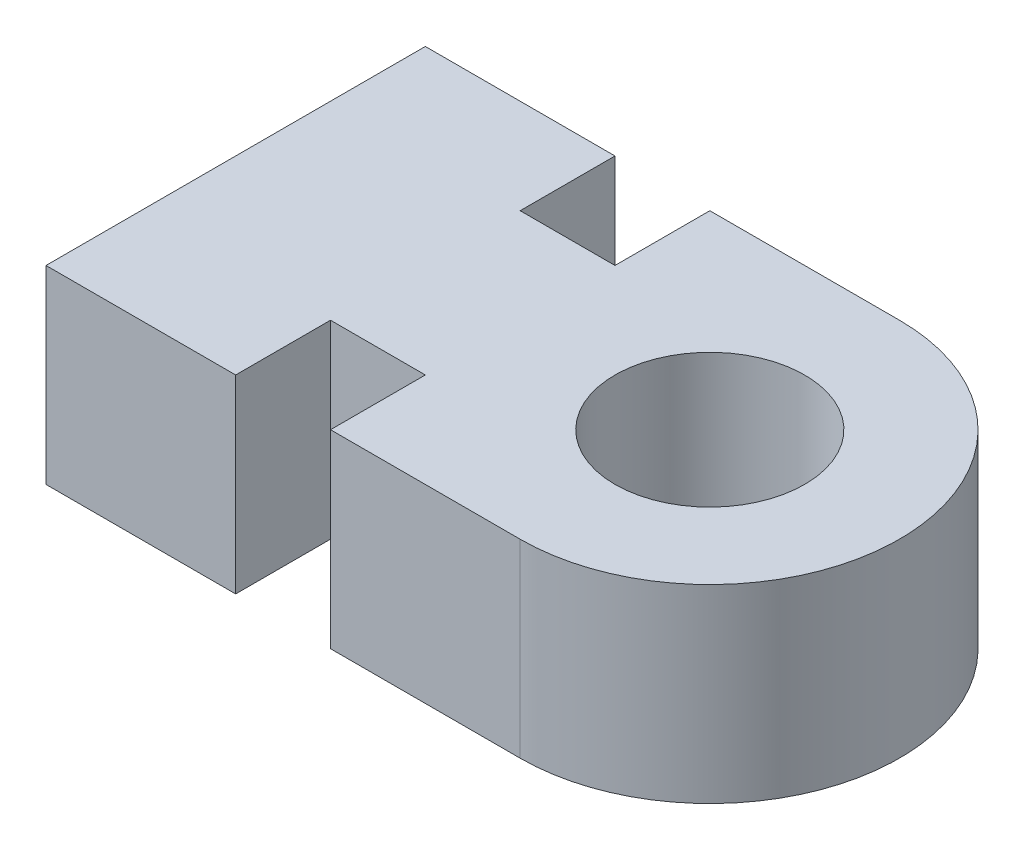
ISO-10303-21;
HEADER;
FILE_DESCRIPTION(('STEP AP214'),'2;1');
FILE_NAME('part.step','',(''),(''),'','','');
FILE_SCHEMA(('AUTOMOTIVE_DESIGN { 1 0 10303 214 1 1 1 1 }'));
ENDSEC;
DATA;
#1=APPLICATION_CONTEXT('core data for automotive mechanical design processes');
#2=APPLICATION_PROTOCOL_DEFINITION('international standard','automotive_design',2000,#1);
#3=PRODUCT_CONTEXT('',#1,'mechanical');
#4=PRODUCT('Part','Part','',(#3));
#5=PRODUCT_RELATED_PRODUCT_CATEGORY('part','',(#4));
#6=PRODUCT_DEFINITION_FORMATION('','',#4);
#7=PRODUCT_DEFINITION_CONTEXT('part definition',#1,'design');
#8=PRODUCT_DEFINITION('design','',#6,#7);
#9=PRODUCT_DEFINITION_SHAPE('','',#8);
#10=(LENGTH_UNIT() NAMED_UNIT(*) SI_UNIT(.MILLI.,.METRE.));
#11=(NAMED_UNIT(*) PLANE_ANGLE_UNIT() SI_UNIT($,.RADIAN.));
#12=(NAMED_UNIT(*) SI_UNIT($,.STERADIAN.) SOLID_ANGLE_UNIT());
#13=UNCERTAINTY_MEASURE_WITH_UNIT(LENGTH_MEASURE(1.E-05),#10,'distance_accuracy_value','');
#14=(GEOMETRIC_REPRESENTATION_CONTEXT(3) GLOBAL_UNCERTAINTY_ASSIGNED_CONTEXT((#13)) GLOBAL_UNIT_ASSIGNED_CONTEXT((#10,
#11,#12)) REPRESENTATION_CONTEXT('',''));
#15=CARTESIAN_POINT('',(0.,0.,0.));
#16=DIRECTION('',(0.,0.,1.));
#17=DIRECTION('',(1.,0.,0.));
#18=AXIS2_PLACEMENT_3D('',#15,#16,#17);
#19=CARTESIAN_POINT('',(0.,10.,0.));
#20=DIRECTION('',(0.,1.,0.));
#21=DIRECTION('',(0.,0.,1.));
#22=AXIS2_PLACEMENT_3D('',#19,#20,#21);
#23=PLANE('',#22);
#24=DIRECTION('',(1.,0.,0.));
#25=VECTOR('',#24,1.);
#26=CARTESIAN_POINT('',(-15.,10.,10.));
#27=LINE('',#26,#25);
#28=CARTESIAN_POINT('',(-25.,10.,10.));
#29=VERTEX_POINT('',#28);
#30=CARTESIAN_POINT('',(-15.,10.,10.));
#31=VERTEX_POINT('',#30);
#32=EDGE_CURVE('E177',#29,#31,#27,.T.);
#33=ORIENTED_EDGE('',*,*,#32,.T.);
#34=DIRECTION('',(0.,0.,-1.));
#35=VECTOR('',#34,1.);
#36=CARTESIAN_POINT('',(-15.,10.,5.));
#37=LINE('',#36,#35);
#38=CARTESIAN_POINT('',(-15.,10.,5.));
#39=VERTEX_POINT('',#38);
#40=EDGE_CURVE('E105',#31,#39,#37,.T.);
#41=ORIENTED_EDGE('',*,*,#40,.T.);
#42=DIRECTION('',(1.,0.,0.));
#43=VECTOR('',#42,1.);
#44=CARTESIAN_POINT('',(-10.,10.,5.));
#45=LINE('',#44,#43);
#46=CARTESIAN_POINT('',(-10.,10.,5.));
#47=VERTEX_POINT('',#46);
#48=EDGE_CURVE('E204',#39,#47,#45,.T.);
#49=ORIENTED_EDGE('',*,*,#48,.T.);
#50=DIRECTION('',(0.,0.,1.));
#51=VECTOR('',#50,1.);
#52=CARTESIAN_POINT('',(-10.,10.,10.));
#53=LINE('',#52,#51);
#54=CARTESIAN_POINT('',(-10.,10.,10.));
#55=VERTEX_POINT('',#54);
#56=EDGE_CURVE('E223',#47,#55,#53,.T.);
#57=ORIENTED_EDGE('',*,*,#56,.T.);
#58=DIRECTION('',(1.,0.,0.));
#59=VECTOR('',#58,1.);
#60=CARTESIAN_POINT('',(0.,10.,10.));
#61=LINE('',#60,#59);
#62=CARTESIAN_POINT('',(0.,10.,10.));
#63=VERTEX_POINT('',#62);
#64=EDGE_CURVE('E220',#55,#63,#61,.T.);
#65=ORIENTED_EDGE('',*,*,#64,.T.);
#66=CARTESIAN_POINT('',(0.,10.,0.));
#67=DIRECTION('',(0.,1.,0.));
#68=DIRECTION('',(0.,0.,1.));
#69=AXIS2_PLACEMENT_3D('',#66,#67,#68);
#70=CIRCLE('',#69,10.);
#71=CARTESIAN_POINT('',(0.,10.,-10.));
#72=VERTEX_POINT('',#71);
#73=EDGE_CURVE('E222',#63,#72,#70,.T.);
#74=ORIENTED_EDGE('',*,*,#73,.T.);
#75=DIRECTION('',(-1.,0.,0.));
#76=VECTOR('',#75,1.);
#77=CARTESIAN_POINT('',(0.,10.,-10.));
#78=LINE('',#77,#76);
#79=CARTESIAN_POINT('',(-10.,10.,-10.));
#80=VERTEX_POINT('',#79);
#81=EDGE_CURVE('E225',#72,#80,#78,.T.);
#82=ORIENTED_EDGE('',*,*,#81,.T.);
#83=DIRECTION('',(0.,0.,1.));
#84=VECTOR('',#83,1.);
#85=CARTESIAN_POINT('',(-10.,10.,-10.));
#86=LINE('',#85,#84);
#87=CARTESIAN_POINT('',(-10.,10.,-5.));
#88=VERTEX_POINT('',#87);
#89=EDGE_CURVE('E231',#80,#88,#86,.T.);
#90=ORIENTED_EDGE('',*,*,#89,.T.);
#91=DIRECTION('',(-1.,0.,0.));
#92=VECTOR('',#91,1.);
#93=CARTESIAN_POINT('',(-10.,10.,-5.));
#94=LINE('',#93,#92);
#95=CARTESIAN_POINT('',(-15.,10.,-5.));
#96=VERTEX_POINT('',#95);
#97=EDGE_CURVE('E136',#88,#96,#94,.T.);
#98=ORIENTED_EDGE('',*,*,#97,.T.);
#99=DIRECTION('',(0.,0.,-1.));
#100=VECTOR('',#99,1.);
#101=CARTESIAN_POINT('',(-15.,10.,-5.));
#102=LINE('',#101,#100);
#103=CARTESIAN_POINT('',(-15.,10.,-10.));
#104=VERTEX_POINT('',#103);
#105=EDGE_CURVE('E130',#96,#104,#102,.T.);
#106=ORIENTED_EDGE('',*,*,#105,.T.);
#107=DIRECTION('',(-1.,0.,0.));
#108=VECTOR('',#107,1.);
#109=CARTESIAN_POINT('',(-15.,10.,-10.));
#110=LINE('',#109,#108);
#111=CARTESIAN_POINT('',(-25.,10.,-10.));
#112=VERTEX_POINT('',#111);
#113=EDGE_CURVE('E134',#104,#112,#110,.T.);
#114=ORIENTED_EDGE('',*,*,#113,.T.);
#115=DIRECTION('',(0.,0.,1.));
#116=VECTOR('',#115,1.);
#117=CARTESIAN_POINT('',(-25.,10.,-10.));
#118=LINE('',#117,#116);
#119=EDGE_CURVE('E50',#112,#29,#118,.T.);
#120=ORIENTED_EDGE('',*,*,#119,.T.);
#121=EDGE_LOOP('',(#33,#41,#49,#57,#65,#74,#82,#90,#98,#106,#114,#120));
#122=FACE_BOUND('',#121,.T.);
#123=CARTESIAN_POINT('',(0.,10.,0.));
#124=DIRECTION('',(0.,1.,0.));
#125=DIRECTION('',(0.,0.,1.));
#126=AXIS2_PLACEMENT_3D('',#123,#124,#125);
#127=CIRCLE('',#126,5.);
#128=CARTESIAN_POINT('',(0.,10.,5.));
#129=VERTEX_POINT('',#128);
#130=EDGE_CURVE('E158',#129,#129,#127,.T.);
#131=ORIENTED_EDGE('',*,*,#130,.F.);
#132=EDGE_LOOP('',(#131));
#133=FACE_BOUND('',#132,.T.);
#134=ADVANCED_FACE('F33',(#122,#133),#23,.T.);
#135=CARTESIAN_POINT('',(0.,0.,0.));
#136=DIRECTION('',(0.,1.,0.));
#137=DIRECTION('',(0.,0.,1.));
#138=AXIS2_PLACEMENT_3D('',#135,#136,#137);
#139=PLANE('',#138);
#140=DIRECTION('',(1.,0.,0.));
#141=VECTOR('',#140,1.);
#142=CARTESIAN_POINT('',(-15.,0.,10.));
#143=LINE('',#142,#141);
#144=CARTESIAN_POINT('',(-25.,0.,10.));
#145=VERTEX_POINT('',#144);
#146=CARTESIAN_POINT('',(-15.,0.,10.));
#147=VERTEX_POINT('',#146);
#148=EDGE_CURVE('E154',#145,#147,#143,.T.);
#149=ORIENTED_EDGE('',*,*,#148,.F.);
#150=DIRECTION('',(0.,0.,1.));
#151=VECTOR('',#150,1.);
#152=CARTESIAN_POINT('',(-25.,0.,-10.));
#153=LINE('',#152,#151);
#154=CARTESIAN_POINT('',(-25.,0.,-10.));
#155=VERTEX_POINT('',#154);
#156=EDGE_CURVE('E97',#155,#145,#153,.T.);
#157=ORIENTED_EDGE('',*,*,#156,.F.);
#158=DIRECTION('',(-1.,0.,0.));
#159=VECTOR('',#158,1.);
#160=CARTESIAN_POINT('',(-15.,0.,-10.));
#161=LINE('',#160,#159);
#162=CARTESIAN_POINT('',(-15.,0.,-10.));
#163=VERTEX_POINT('',#162);
#164=EDGE_CURVE('E91',#163,#155,#161,.T.);
#165=ORIENTED_EDGE('',*,*,#164,.F.);
#166=DIRECTION('',(0.,0.,-1.));
#167=VECTOR('',#166,1.);
#168=CARTESIAN_POINT('',(-15.,0.,-5.));
#169=LINE('',#168,#167);
#170=CARTESIAN_POINT('',(-15.,0.,-5.));
#171=VERTEX_POINT('',#170);
#172=EDGE_CURVE('E144',#171,#163,#169,.T.);
#173=ORIENTED_EDGE('',*,*,#172,.F.);
#174=DIRECTION('',(-1.,0.,0.));
#175=VECTOR('',#174,1.);
#176=CARTESIAN_POINT('',(-10.,0.,-5.));
#177=LINE('',#176,#175);
#178=CARTESIAN_POINT('',(-10.,0.,-5.));
#179=VERTEX_POINT('',#178);
#180=EDGE_CURVE('E172',#179,#171,#177,.T.);
#181=ORIENTED_EDGE('',*,*,#180,.F.);
#182=DIRECTION('',(0.,0.,1.));
#183=VECTOR('',#182,1.);
#184=CARTESIAN_POINT('',(-10.,0.,-10.));
#185=LINE('',#184,#183);
#186=CARTESIAN_POINT('',(-10.,0.,-10.));
#187=VERTEX_POINT('',#186);
#188=EDGE_CURVE('E170',#187,#179,#185,.T.);
#189=ORIENTED_EDGE('',*,*,#188,.F.);
#190=DIRECTION('',(-1.,0.,0.));
#191=VECTOR('',#190,1.);
#192=CARTESIAN_POINT('',(0.,0.,-10.));
#193=LINE('',#192,#191);
#194=CARTESIAN_POINT('',(0.,0.,-10.));
#195=VERTEX_POINT('',#194);
#196=EDGE_CURVE('E168',#195,#187,#193,.T.);
#197=ORIENTED_EDGE('',*,*,#196,.F.);
#198=CARTESIAN_POINT('',(0.,0.,0.));
#199=DIRECTION('',(0.,1.,0.));
#200=DIRECTION('',(0.,0.,1.));
#201=AXIS2_PLACEMENT_3D('',#198,#199,#200);
#202=CIRCLE('',#201,10.);
#203=CARTESIAN_POINT('',(0.,0.,10.));
#204=VERTEX_POINT('',#203);
#205=EDGE_CURVE('E166',#204,#195,#202,.T.);
#206=ORIENTED_EDGE('',*,*,#205,.F.);
#207=DIRECTION('',(1.,0.,0.));
#208=VECTOR('',#207,1.);
#209=CARTESIAN_POINT('',(0.,0.,10.));
#210=LINE('',#209,#208);
#211=CARTESIAN_POINT('',(-10.,0.,10.));
#212=VERTEX_POINT('',#211);
#213=EDGE_CURVE('E164',#212,#204,#210,.T.);
#214=ORIENTED_EDGE('',*,*,#213,.F.);
#215=DIRECTION('',(0.,0.,1.));
#216=VECTOR('',#215,1.);
#217=CARTESIAN_POINT('',(-10.,0.,10.));
#218=LINE('',#217,#216);
#219=CARTESIAN_POINT('',(-10.,0.,5.));
#220=VERTEX_POINT('',#219);
#221=EDGE_CURVE('E162',#220,#212,#218,.T.);
#222=ORIENTED_EDGE('',*,*,#221,.F.);
#223=DIRECTION('',(1.,0.,0.));
#224=VECTOR('',#223,1.);
#225=CARTESIAN_POINT('',(-10.,0.,5.));
#226=LINE('',#225,#224);
#227=CARTESIAN_POINT('',(-15.,0.,5.));
#228=VERTEX_POINT('',#227);
#229=EDGE_CURVE('E160',#228,#220,#226,.T.);
#230=ORIENTED_EDGE('',*,*,#229,.F.);
#231=DIRECTION('',(0.,0.,-1.));
#232=VECTOR('',#231,1.);
#233=CARTESIAN_POINT('',(-15.,0.,5.));
#234=LINE('',#233,#232);
#235=EDGE_CURVE('E157',#147,#228,#234,.T.);
#236=ORIENTED_EDGE('',*,*,#235,.F.);
#237=EDGE_LOOP('',(#149,#157,#165,#173,#181,#189,#197,#206,#214,#222,#230,#236));
#238=FACE_BOUND('',#237,.T.);
#239=CARTESIAN_POINT('',(0.,0.,0.));
#240=DIRECTION('',(0.,1.,0.));
#241=DIRECTION('',(0.,0.,1.));
#242=AXIS2_PLACEMENT_3D('',#239,#240,#241);
#243=CIRCLE('',#242,5.);
#244=CARTESIAN_POINT('',(0.,0.,5.));
#245=VERTEX_POINT('',#244);
#246=EDGE_CURVE('E378',#245,#245,#243,.T.);
#247=ORIENTED_EDGE('',*,*,#246,.T.);
#248=EDGE_LOOP('',(#247));
#249=FACE_BOUND('',#248,.T.);
#250=ADVANCED_FACE('F208',(#238,#249),#139,.F.);
#251=CARTESIAN_POINT('',(-15.,10.,10.));
#252=DIRECTION('',(0.,0.,-1.));
#253=DIRECTION('',(-1.,0.,0.));
#254=AXIS2_PLACEMENT_3D('',#251,#252,#253);
#255=PLANE('',#254);
#256=ORIENTED_EDGE('',*,*,#148,.T.);
#257=DIRECTION('',(0.,-1.,0.));
#258=VECTOR('',#257,1.);
#259=CARTESIAN_POINT('',(-15.,10.,10.));
#260=LINE('',#259,#258);
#261=EDGE_CURVE('E11',#31,#147,#260,.T.);
#262=ORIENTED_EDGE('',*,*,#261,.F.);
#263=ORIENTED_EDGE('',*,*,#32,.F.);
#264=DIRECTION('',(0.,-1.,0.));
#265=VECTOR('',#264,1.);
#266=CARTESIAN_POINT('',(-25.,10.,10.));
#267=LINE('',#266,#265);
#268=EDGE_CURVE('E150',#29,#145,#267,.T.);
#269=ORIENTED_EDGE('',*,*,#268,.T.);
#270=EDGE_LOOP('',(#256,#262,#263,#269));
#271=FACE_BOUND('',#270,.T.);
#272=ADVANCED_FACE('F35',(#271),#255,.F.);
#273=CARTESIAN_POINT('',(-15.,10.,5.));
#274=DIRECTION('',(-1.,0.,0.));
#275=DIRECTION('',(0.,0.,1.));
#276=AXIS2_PLACEMENT_3D('',#273,#274,#275);
#277=PLANE('',#276);
#278=ORIENTED_EDGE('',*,*,#235,.T.);
#279=DIRECTION('',(0.,-1.,0.));
#280=VECTOR('',#279,1.);
#281=CARTESIAN_POINT('',(-15.,10.,5.));
#282=LINE('',#281,#280);
#283=EDGE_CURVE('E42',#39,#228,#282,.T.);
#284=ORIENTED_EDGE('',*,*,#283,.F.);
#285=ORIENTED_EDGE('',*,*,#40,.F.);
#286=ORIENTED_EDGE('',*,*,#261,.T.);
#287=EDGE_LOOP('',(#278,#284,#285,#286));
#288=FACE_BOUND('',#287,.T.);
#289=ADVANCED_FACE('F265',(#288),#277,.F.);
#290=CARTESIAN_POINT('',(-10.,10.,5.));
#291=DIRECTION('',(0.,0.,-1.));
#292=DIRECTION('',(-1.,0.,0.));
#293=AXIS2_PLACEMENT_3D('',#290,#291,#292);
#294=PLANE('',#293);
#295=ORIENTED_EDGE('',*,*,#229,.T.);
#296=DIRECTION('',(0.,-1.,0.));
#297=VECTOR('',#296,1.);
#298=CARTESIAN_POINT('',(-10.,10.,5.));
#299=LINE('',#298,#297);
#300=EDGE_CURVE('E196',#47,#220,#299,.T.);
#301=ORIENTED_EDGE('',*,*,#300,.F.);
#302=ORIENTED_EDGE('',*,*,#48,.F.);
#303=ORIENTED_EDGE('',*,*,#283,.T.);
#304=EDGE_LOOP('',(#295,#301,#302,#303));
#305=FACE_BOUND('',#304,.T.);
#306=ADVANCED_FACE('F202',(#305),#294,.F.);
#307=CARTESIAN_POINT('',(-10.,10.,10.));
#308=DIRECTION('',(1.,0.,0.));
#309=DIRECTION('',(0.,0.,-1.));
#310=AXIS2_PLACEMENT_3D('',#307,#308,#309);
#311=PLANE('',#310);
#312=ORIENTED_EDGE('',*,*,#221,.T.);
#313=DIRECTION('',(0.,-1.,0.));
#314=VECTOR('',#313,1.);
#315=CARTESIAN_POINT('',(-10.,10.,10.));
#316=LINE('',#315,#314);
#317=EDGE_CURVE('E193',#55,#212,#316,.T.);
#318=ORIENTED_EDGE('',*,*,#317,.F.);
#319=ORIENTED_EDGE('',*,*,#56,.F.);
#320=ORIENTED_EDGE('',*,*,#300,.T.);
#321=EDGE_LOOP('',(#312,#318,#319,#320));
#322=FACE_BOUND('',#321,.T.);
#323=ADVANCED_FACE('F214',(#322),#311,.F.);
#324=CARTESIAN_POINT('',(0.,10.,10.));
#325=DIRECTION('',(0.,0.,-1.));
#326=DIRECTION('',(-1.,0.,0.));
#327=AXIS2_PLACEMENT_3D('',#324,#325,#326);
#328=PLANE('',#327);
#329=ORIENTED_EDGE('',*,*,#213,.T.);
#330=DIRECTION('',(0.,-1.,0.));
#331=VECTOR('',#330,1.);
#332=CARTESIAN_POINT('',(0.,10.,10.));
#333=LINE('',#332,#331);
#334=EDGE_CURVE('E190',#63,#204,#333,.T.);
#335=ORIENTED_EDGE('',*,*,#334,.F.);
#336=ORIENTED_EDGE('',*,*,#64,.F.);
#337=ORIENTED_EDGE('',*,*,#317,.T.);
#338=EDGE_LOOP('',(#329,#335,#336,#337));
#339=FACE_BOUND('',#338,.T.);
#340=ADVANCED_FACE('F218',(#339),#328,.F.);
#341=CARTESIAN_POINT('',(0.,10.,0.));
#342=DIRECTION('',(0.,-1.,0.));
#343=DIRECTION('',(0.,0.,-1.));
#344=AXIS2_PLACEMENT_3D('',#341,#342,#343);
#345=CYLINDRICAL_SURFACE('',#344,10.);
#346=ORIENTED_EDGE('',*,*,#205,.T.);
#347=DIRECTION('',(0.,-1.,0.));
#348=VECTOR('',#347,1.);
#349=CARTESIAN_POINT('',(0.,10.,-10.));
#350=LINE('',#349,#348);
#351=EDGE_CURVE('E187',#72,#195,#350,.T.);
#352=ORIENTED_EDGE('',*,*,#351,.F.);
#353=ORIENTED_EDGE('',*,*,#73,.F.);
#354=ORIENTED_EDGE('',*,*,#334,.T.);
#355=EDGE_LOOP('',(#346,#352,#353,#354));
#356=FACE_BOUND('',#355,.T.);
#357=ADVANCED_FACE('F278',(#356),#345,.T.);
#358=CARTESIAN_POINT('',(0.,10.,-10.));
#359=DIRECTION('',(0.,0.,1.));
#360=DIRECTION('',(1.,0.,0.));
#361=AXIS2_PLACEMENT_3D('',#358,#359,#360);
#362=PLANE('',#361);
#363=ORIENTED_EDGE('',*,*,#196,.T.);
#364=DIRECTION('',(0.,-1.,0.));
#365=VECTOR('',#364,1.);
#366=CARTESIAN_POINT('',(-10.,10.,-10.));
#367=LINE('',#366,#365);
#368=EDGE_CURVE('E184',#80,#187,#367,.T.);
#369=ORIENTED_EDGE('',*,*,#368,.F.);
#370=ORIENTED_EDGE('',*,*,#81,.F.);
#371=ORIENTED_EDGE('',*,*,#351,.T.);
#372=EDGE_LOOP('',(#363,#369,#370,#371));
#373=FACE_BOUND('',#372,.T.);
#374=ADVANCED_FACE('F281',(#373),#362,.F.);
#375=CARTESIAN_POINT('',(-10.,10.,-10.));
#376=DIRECTION('',(1.,0.,0.));
#377=DIRECTION('',(0.,0.,-1.));
#378=AXIS2_PLACEMENT_3D('',#375,#376,#377);
#379=PLANE('',#378);
#380=ORIENTED_EDGE('',*,*,#188,.T.);
#381=DIRECTION('',(0.,-1.,0.));
#382=VECTOR('',#381,1.);
#383=CARTESIAN_POINT('',(-10.,10.,-5.));
#384=LINE('',#383,#382);
#385=EDGE_CURVE('E181',#88,#179,#384,.T.);
#386=ORIENTED_EDGE('',*,*,#385,.F.);
#387=ORIENTED_EDGE('',*,*,#89,.F.);
#388=ORIENTED_EDGE('',*,*,#368,.T.);
#389=EDGE_LOOP('',(#380,#386,#387,#388));
#390=FACE_BOUND('',#389,.T.);
#391=ADVANCED_FACE('F237',(#390),#379,.F.);
#392=CARTESIAN_POINT('',(-10.,10.,-5.));
#393=DIRECTION('',(0.,0.,1.));
#394=DIRECTION('',(1.,0.,0.));
#395=AXIS2_PLACEMENT_3D('',#392,#393,#394);
#396=PLANE('',#395);
#397=ORIENTED_EDGE('',*,*,#180,.T.);
#398=DIRECTION('',(0.,-1.,0.));
#399=VECTOR('',#398,1.);
#400=CARTESIAN_POINT('',(-15.,10.,-5.));
#401=LINE('',#400,#399);
#402=EDGE_CURVE('E145',#96,#171,#401,.T.);
#403=ORIENTED_EDGE('',*,*,#402,.F.);
#404=ORIENTED_EDGE('',*,*,#97,.F.);
#405=ORIENTED_EDGE('',*,*,#385,.T.);
#406=EDGE_LOOP('',(#397,#403,#404,#405));
#407=FACE_BOUND('',#406,.T.);
#408=ADVANCED_FACE('F241',(#407),#396,.F.);
#409=CARTESIAN_POINT('',(-15.,10.,-5.));
#410=DIRECTION('',(-1.,0.,0.));
#411=DIRECTION('',(0.,0.,1.));
#412=AXIS2_PLACEMENT_3D('',#409,#410,#411);
#413=PLANE('',#412);
#414=ORIENTED_EDGE('',*,*,#172,.T.);
#415=DIRECTION('',(0.,-1.,0.));
#416=VECTOR('',#415,1.);
#417=CARTESIAN_POINT('',(-15.,10.,-10.));
#418=LINE('',#417,#416);
#419=EDGE_CURVE('E141',#104,#163,#418,.T.);
#420=ORIENTED_EDGE('',*,*,#419,.F.);
#421=ORIENTED_EDGE('',*,*,#105,.F.);
#422=ORIENTED_EDGE('',*,*,#402,.T.);
#423=EDGE_LOOP('',(#414,#420,#421,#422));
#424=FACE_BOUND('',#423,.T.);
#425=ADVANCED_FACE('F142',(#424),#413,.F.);
#426=CARTESIAN_POINT('',(-15.,10.,-10.));
#427=DIRECTION('',(0.,0.,1.));
#428=DIRECTION('',(1.,0.,0.));
#429=AXIS2_PLACEMENT_3D('',#426,#427,#428);
#430=PLANE('',#429);
#431=ORIENTED_EDGE('',*,*,#164,.T.);
#432=DIRECTION('',(0.,-1.,0.));
#433=VECTOR('',#432,1.);
#434=CARTESIAN_POINT('',(-25.,10.,-10.));
#435=LINE('',#434,#433);
#436=EDGE_CURVE('E146',#112,#155,#435,.T.);
#437=ORIENTED_EDGE('',*,*,#436,.F.);
#438=ORIENTED_EDGE('',*,*,#113,.F.);
#439=ORIENTED_EDGE('',*,*,#419,.T.);
#440=EDGE_LOOP('',(#431,#437,#438,#439));
#441=FACE_BOUND('',#440,.T.);
#442=ADVANCED_FACE('F148',(#441),#430,.F.);
#443=CARTESIAN_POINT('',(-25.,10.,-10.));
#444=DIRECTION('',(1.,0.,0.));
#445=DIRECTION('',(0.,0.,-1.));
#446=AXIS2_PLACEMENT_3D('',#443,#444,#445);
#447=PLANE('',#446);
#448=ORIENTED_EDGE('',*,*,#156,.T.);
#449=ORIENTED_EDGE('',*,*,#268,.F.);
#450=ORIENTED_EDGE('',*,*,#119,.F.);
#451=ORIENTED_EDGE('',*,*,#436,.T.);
#452=EDGE_LOOP('',(#448,#449,#450,#451));
#453=FACE_BOUND('',#452,.T.);
#454=ADVANCED_FACE('F245',(#453),#447,.F.);
#455=CARTESIAN_POINT('',(0.,10.,0.));
#456=DIRECTION('',(0.,-1.,0.));
#457=DIRECTION('',(0.,0.,-1.));
#458=AXIS2_PLACEMENT_3D('',#455,#456,#457);
#459=CYLINDRICAL_SURFACE('',#458,5.);
#460=ORIENTED_EDGE('',*,*,#130,.T.);
#461=EDGE_LOOP('',(#460));
#462=FACE_BOUND('',#461,.T.);
#463=ORIENTED_EDGE('',*,*,#246,.F.);
#464=EDGE_LOOP('',(#463));
#465=FACE_BOUND('',#464,.T.);
#466=ADVANCED_FACE('F247',(#462,#465),#459,.F.);
#467=CLOSED_SHELL('',(#134,#250,#272,#289,#306,#323,#340,#357,#374,#391,#408,#425,#442,#454,#466));
#468=MANIFOLD_SOLID_BREP('B2',#467);
#469=ADVANCED_BREP_SHAPE_REPRESENTATION('',(#18,#468),#14);
#470=SHAPE_DEFINITION_REPRESENTATION(#9,#469);
ENDSEC;
END-ISO-10303-21;
